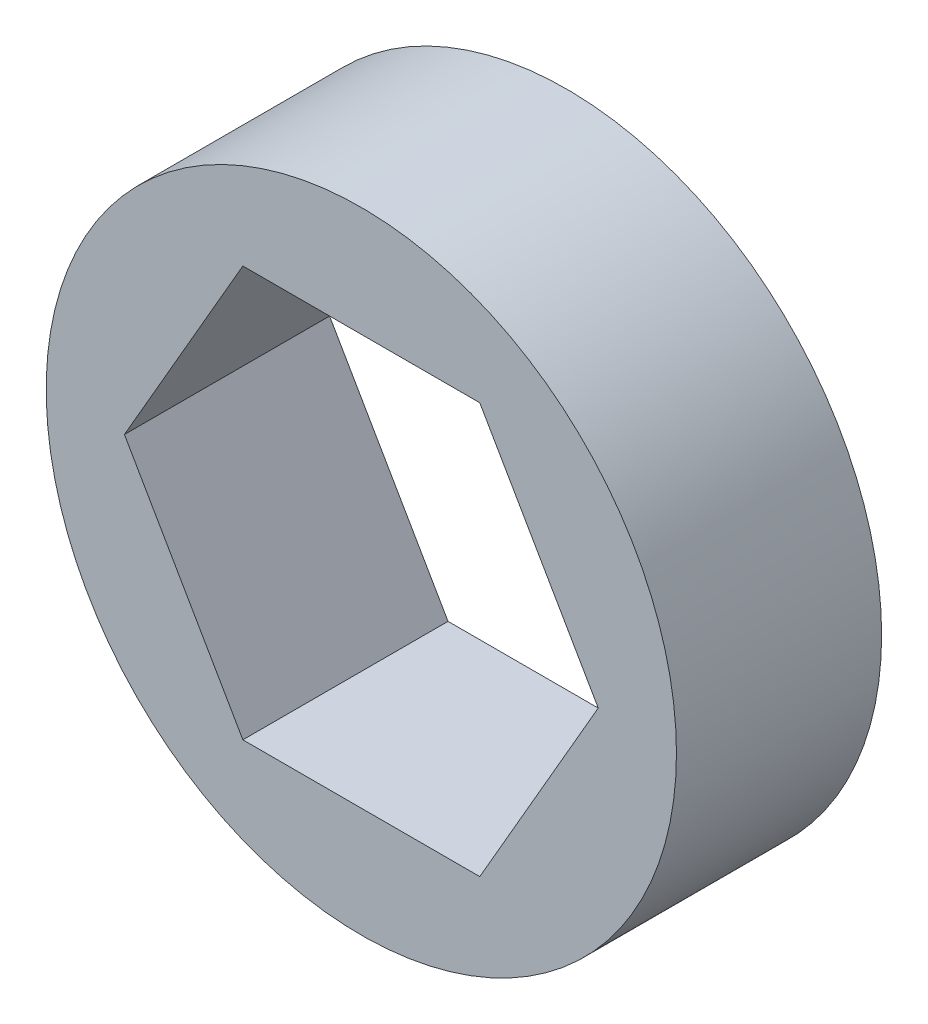
ISO-10303-21;
HEADER;
FILE_DESCRIPTION(('STEP AP214'),'2;1');
FILE_NAME('part.step','',(''),(''),'','','');
FILE_SCHEMA(('AUTOMOTIVE_DESIGN { 1 0 10303 214 1 1 1 1 }'));
ENDSEC;
DATA;
#1=APPLICATION_CONTEXT('core data for automotive mechanical design processes');
#2=APPLICATION_PROTOCOL_DEFINITION('international standard','automotive_design',2000,#1);
#3=PRODUCT_CONTEXT('',#1,'mechanical');
#4=PRODUCT('Part','Part','',(#3));
#5=PRODUCT_RELATED_PRODUCT_CATEGORY('part','',(#4));
#6=PRODUCT_DEFINITION_FORMATION('','',#4);
#7=PRODUCT_DEFINITION_CONTEXT('part definition',#1,'design');
#8=PRODUCT_DEFINITION('design','',#6,#7);
#9=PRODUCT_DEFINITION_SHAPE('','',#8);
#10=(LENGTH_UNIT() NAMED_UNIT(*) SI_UNIT(.MILLI.,.METRE.));
#11=(NAMED_UNIT(*) PLANE_ANGLE_UNIT() SI_UNIT($,.RADIAN.));
#12=(NAMED_UNIT(*) SI_UNIT($,.STERADIAN.) SOLID_ANGLE_UNIT());
#13=UNCERTAINTY_MEASURE_WITH_UNIT(LENGTH_MEASURE(1.E-05),#10,'distance_accuracy_value','');
#14=(GEOMETRIC_REPRESENTATION_CONTEXT(3) GLOBAL_UNCERTAINTY_ASSIGNED_CONTEXT((#13)) GLOBAL_UNIT_ASSIGNED_CONTEXT((#10,
#11,#12)) REPRESENTATION_CONTEXT('',''));
#15=CARTESIAN_POINT('',(0.,0.,0.));
#16=DIRECTION('',(0.,0.,1.));
#17=DIRECTION('',(1.,0.,0.));
#18=AXIS2_PLACEMENT_3D('',#15,#16,#17);
#19=CARTESIAN_POINT('',(0.,0.,6.35));
#20=DIRECTION('',(0.,0.,1.));
#21=DIRECTION('',(1.,0.,0.));
#22=AXIS2_PLACEMENT_3D('',#19,#20,#21);
#23=PLANE('',#22);
#24=CARTESIAN_POINT('',(0.,0.,6.35));
#25=DIRECTION('',(0.,0.,1.));
#26=DIRECTION('',(1.,0.,0.));
#27=AXIS2_PLACEMENT_3D('',#24,#25,#26);
#28=CIRCLE('',#27,9.7536);
#29=CARTESIAN_POINT('',(9.7536,0.,6.35));
#30=VERTEX_POINT('',#29);
#31=EDGE_CURVE('E11',#30,#30,#28,.T.);
#32=ORIENTED_EDGE('',*,*,#31,.T.);
#33=EDGE_LOOP('',(#32));
#34=FACE_BOUND('',#33,.T.);
#35=DIRECTION('',(0.5,-0.866025403784439,0.));
#36=VECTOR('',#35,1.);
#37=CARTESIAN_POINT('',(-7.33234841870825,0.,6.35));
#38=LINE('',#37,#36);
#39=CARTESIAN_POINT('',(-7.33234841870825,0.,6.35));
#40=VERTEX_POINT('',#39);
#41=CARTESIAN_POINT('',(-3.66617420935412,-6.35,6.35));
#42=VERTEX_POINT('',#41);
#43=EDGE_CURVE('E94',#40,#42,#38,.T.);
#44=ORIENTED_EDGE('',*,*,#43,.F.);
#45=DIRECTION('',(-0.5,-0.866025403784439,0.));
#46=VECTOR('',#45,1.);
#47=CARTESIAN_POINT('',(-3.66617420935412,6.35,6.35));
#48=LINE('',#47,#46);
#49=CARTESIAN_POINT('',(-3.66617420935412,6.35,6.35));
#50=VERTEX_POINT('',#49);
#51=EDGE_CURVE('E86',#50,#40,#48,.T.);
#52=ORIENTED_EDGE('',*,*,#51,.F.);
#53=DIRECTION('',(-1.,0.,0.));
#54=VECTOR('',#53,1.);
#55=CARTESIAN_POINT('',(3.66617420935412,6.35,6.35));
#56=LINE('',#55,#54);
#57=CARTESIAN_POINT('',(3.66617420935412,6.35,6.35));
#58=VERTEX_POINT('',#57);
#59=EDGE_CURVE('E114',#58,#50,#56,.T.);
#60=ORIENTED_EDGE('',*,*,#59,.F.);
#61=DIRECTION('',(-0.5,0.866025403784439,0.));
#62=VECTOR('',#61,1.);
#63=CARTESIAN_POINT('',(7.33234841870825,0.,6.35));
#64=LINE('',#63,#62);
#65=CARTESIAN_POINT('',(7.33234841870825,0.,6.35));
#66=VERTEX_POINT('',#65);
#67=EDGE_CURVE('E112',#66,#58,#64,.T.);
#68=ORIENTED_EDGE('',*,*,#67,.F.);
#69=DIRECTION('',(0.5,0.866025403784439,0.));
#70=VECTOR('',#69,1.);
#71=CARTESIAN_POINT('',(3.66617420935412,-6.35,6.35));
#72=LINE('',#71,#70);
#73=CARTESIAN_POINT('',(3.66617420935412,-6.35,6.35));
#74=VERTEX_POINT('',#73);
#75=EDGE_CURVE('E108',#74,#66,#72,.T.);
#76=ORIENTED_EDGE('',*,*,#75,.F.);
#77=DIRECTION('',(1.,0.,0.));
#78=VECTOR('',#77,1.);
#79=CARTESIAN_POINT('',(-3.66617420935412,-6.35,6.35));
#80=LINE('',#79,#78);
#81=EDGE_CURVE('E106',#42,#74,#80,.T.);
#82=ORIENTED_EDGE('',*,*,#81,.F.);
#83=EDGE_LOOP('',(#44,#52,#60,#68,#76,#82));
#84=FACE_BOUND('',#83,.T.);
#85=ADVANCED_FACE('F33',(#34,#84),#23,.T.);
#86=CARTESIAN_POINT('',(0.,0.,0.));
#87=DIRECTION('',(0.,0.,1.));
#88=DIRECTION('',(1.,0.,0.));
#89=AXIS2_PLACEMENT_3D('',#86,#87,#88);
#90=PLANE('',#89);
#91=CARTESIAN_POINT('',(0.,0.,0.));
#92=DIRECTION('',(0.,0.,1.));
#93=DIRECTION('',(1.,0.,0.));
#94=AXIS2_PLACEMENT_3D('',#91,#92,#93);
#95=CIRCLE('',#94,9.7536);
#96=CARTESIAN_POINT('',(9.7536,0.,0.));
#97=VERTEX_POINT('',#96);
#98=EDGE_CURVE('E37',#97,#97,#95,.T.);
#99=ORIENTED_EDGE('',*,*,#98,.F.);
#100=EDGE_LOOP('',(#99));
#101=FACE_BOUND('',#100,.T.);
#102=DIRECTION('',(-0.5,-0.866025403784439,0.));
#103=VECTOR('',#102,1.);
#104=CARTESIAN_POINT('',(-3.66617420935412,6.35,0.));
#105=LINE('',#104,#103);
#106=CARTESIAN_POINT('',(-3.66617420935412,6.35,0.));
#107=VERTEX_POINT('',#106);
#108=CARTESIAN_POINT('',(-7.33234841870825,0.,0.));
#109=VERTEX_POINT('',#108);
#110=EDGE_CURVE('E56',#107,#109,#105,.T.);
#111=ORIENTED_EDGE('',*,*,#110,.T.);
#112=DIRECTION('',(0.5,-0.866025403784439,0.));
#113=VECTOR('',#112,1.);
#114=CARTESIAN_POINT('',(-7.33234841870825,0.,0.));
#115=LINE('',#114,#113);
#116=CARTESIAN_POINT('',(-3.66617420935412,-6.35,0.));
#117=VERTEX_POINT('',#116);
#118=EDGE_CURVE('E101',#109,#117,#115,.T.);
#119=ORIENTED_EDGE('',*,*,#118,.T.);
#120=DIRECTION('',(1.,0.,0.));
#121=VECTOR('',#120,1.);
#122=CARTESIAN_POINT('',(-3.66617420935412,-6.35,0.));
#123=LINE('',#122,#121);
#124=CARTESIAN_POINT('',(3.66617420935412,-6.35,0.));
#125=VERTEX_POINT('',#124);
#126=EDGE_CURVE('E118',#117,#125,#123,.T.);
#127=ORIENTED_EDGE('',*,*,#126,.T.);
#128=DIRECTION('',(0.5,0.866025403784439,0.));
#129=VECTOR('',#128,1.);
#130=CARTESIAN_POINT('',(3.66617420935412,-6.35,0.));
#131=LINE('',#130,#129);
#132=CARTESIAN_POINT('',(7.33234841870825,0.,0.));
#133=VERTEX_POINT('',#132);
#134=EDGE_CURVE('E121',#125,#133,#131,.T.);
#135=ORIENTED_EDGE('',*,*,#134,.T.);
#136=DIRECTION('',(-0.5,0.866025403784439,0.));
#137=VECTOR('',#136,1.);
#138=CARTESIAN_POINT('',(7.33234841870825,0.,0.));
#139=LINE('',#138,#137);
#140=CARTESIAN_POINT('',(3.66617420935412,6.35,0.));
#141=VERTEX_POINT('',#140);
#142=EDGE_CURVE('E124',#133,#141,#139,.T.);
#143=ORIENTED_EDGE('',*,*,#142,.T.);
#144=DIRECTION('',(-1.,0.,0.));
#145=VECTOR('',#144,1.);
#146=CARTESIAN_POINT('',(3.66617420935412,6.35,0.));
#147=LINE('',#146,#145);
#148=EDGE_CURVE('E95',#141,#107,#147,.T.);
#149=ORIENTED_EDGE('',*,*,#148,.T.);
#150=EDGE_LOOP('',(#111,#119,#127,#135,#143,#149));
#151=FACE_BOUND('',#150,.T.);
#152=ADVANCED_FACE('F141',(#101,#151),#90,.F.);
#153=CARTESIAN_POINT('',(0.,0.,6.35));
#154=DIRECTION('',(0.,0.,-1.));
#155=DIRECTION('',(-1.,0.,0.));
#156=AXIS2_PLACEMENT_3D('',#153,#154,#155);
#157=CYLINDRICAL_SURFACE('',#156,9.7536);
#158=ORIENTED_EDGE('',*,*,#31,.F.);
#159=EDGE_LOOP('',(#158));
#160=FACE_BOUND('',#159,.T.);
#161=ORIENTED_EDGE('',*,*,#98,.T.);
#162=EDGE_LOOP('',(#161));
#163=FACE_BOUND('',#162,.T.);
#164=ADVANCED_FACE('F35',(#160,#163),#157,.T.);
#165=CARTESIAN_POINT('',(-3.66617420935412,6.35,6.35));
#166=DIRECTION('',(0.866025403784439,-0.5,0.));
#167=DIRECTION('',(0.5,0.866025403784439,0.));
#168=AXIS2_PLACEMENT_3D('',#165,#166,#167);
#169=PLANE('',#168);
#170=ORIENTED_EDGE('',*,*,#110,.F.);
#171=DIRECTION('',(0.,0.,-1.));
#172=VECTOR('',#171,1.);
#173=CARTESIAN_POINT('',(-3.66617420935412,6.35,6.35));
#174=LINE('',#173,#172);
#175=EDGE_CURVE('E90',#50,#107,#174,.T.);
#176=ORIENTED_EDGE('',*,*,#175,.F.);
#177=ORIENTED_EDGE('',*,*,#51,.T.);
#178=DIRECTION('',(0.,0.,-1.));
#179=VECTOR('',#178,1.);
#180=CARTESIAN_POINT('',(-7.33234841870825,0.,6.35));
#181=LINE('',#180,#179);
#182=EDGE_CURVE('E89',#40,#109,#181,.T.);
#183=ORIENTED_EDGE('',*,*,#182,.T.);
#184=EDGE_LOOP('',(#170,#176,#177,#183));
#185=FACE_BOUND('',#184,.T.);
#186=ADVANCED_FACE('F88',(#185),#169,.T.);
#187=CARTESIAN_POINT('',(-7.33234841870825,0.,6.35));
#188=DIRECTION('',(0.866025403784439,0.5,0.));
#189=DIRECTION('',(-0.5,0.866025403784439,0.));
#190=AXIS2_PLACEMENT_3D('',#187,#188,#189);
#191=PLANE('',#190);
#192=ORIENTED_EDGE('',*,*,#118,.F.);
#193=ORIENTED_EDGE('',*,*,#182,.F.);
#194=ORIENTED_EDGE('',*,*,#43,.T.);
#195=DIRECTION('',(0.,0.,-1.));
#196=VECTOR('',#195,1.);
#197=CARTESIAN_POINT('',(-3.66617420935412,-6.35,6.35));
#198=LINE('',#197,#196);
#199=EDGE_CURVE('E102',#42,#117,#198,.T.);
#200=ORIENTED_EDGE('',*,*,#199,.T.);
#201=EDGE_LOOP('',(#192,#193,#194,#200));
#202=FACE_BOUND('',#201,.T.);
#203=ADVANCED_FACE('F98',(#202),#191,.T.);
#204=CARTESIAN_POINT('',(-3.66617420935412,-6.35,6.35));
#205=DIRECTION('',(0.,1.,0.));
#206=DIRECTION('',(-1.,0.,0.));
#207=AXIS2_PLACEMENT_3D('',#204,#205,#206);
#208=PLANE('',#207);
#209=ORIENTED_EDGE('',*,*,#126,.F.);
#210=ORIENTED_EDGE('',*,*,#199,.F.);
#211=ORIENTED_EDGE('',*,*,#81,.T.);
#212=DIRECTION('',(0.,0.,-1.));
#213=VECTOR('',#212,1.);
#214=CARTESIAN_POINT('',(3.66617420935412,-6.35,6.35));
#215=LINE('',#214,#213);
#216=EDGE_CURVE('E133',#74,#125,#215,.T.);
#217=ORIENTED_EDGE('',*,*,#216,.T.);
#218=EDGE_LOOP('',(#209,#210,#211,#217));
#219=FACE_BOUND('',#218,.T.);
#220=ADVANCED_FACE('F137',(#219),#208,.T.);
#221=CARTESIAN_POINT('',(3.66617420935412,-6.35,6.35));
#222=DIRECTION('',(-0.866025403784439,0.5,0.));
#223=DIRECTION('',(-0.5,-0.866025403784439,0.));
#224=AXIS2_PLACEMENT_3D('',#221,#222,#223);
#225=PLANE('',#224);
#226=ORIENTED_EDGE('',*,*,#134,.F.);
#227=ORIENTED_EDGE('',*,*,#216,.F.);
#228=ORIENTED_EDGE('',*,*,#75,.T.);
#229=DIRECTION('',(0.,0.,-1.));
#230=VECTOR('',#229,1.);
#231=CARTESIAN_POINT('',(7.33234841870825,0.,6.35));
#232=LINE('',#231,#230);
#233=EDGE_CURVE('E131',#66,#133,#232,.T.);
#234=ORIENTED_EDGE('',*,*,#233,.T.);
#235=EDGE_LOOP('',(#226,#227,#228,#234));
#236=FACE_BOUND('',#235,.T.);
#237=ADVANCED_FACE('F149',(#236),#225,.T.);
#238=CARTESIAN_POINT('',(7.33234841870825,0.,6.35));
#239=DIRECTION('',(-0.866025403784439,-0.5,0.));
#240=DIRECTION('',(0.5,-0.866025403784439,0.));
#241=AXIS2_PLACEMENT_3D('',#238,#239,#240);
#242=PLANE('',#241);
#243=ORIENTED_EDGE('',*,*,#142,.F.);
#244=ORIENTED_EDGE('',*,*,#233,.F.);
#245=ORIENTED_EDGE('',*,*,#67,.T.);
#246=DIRECTION('',(0.,0.,-1.));
#247=VECTOR('',#246,1.);
#248=CARTESIAN_POINT('',(3.66617420935412,6.35,6.35));
#249=LINE('',#248,#247);
#250=EDGE_CURVE('E48',#58,#141,#249,.T.);
#251=ORIENTED_EDGE('',*,*,#250,.T.);
#252=EDGE_LOOP('',(#243,#244,#245,#251));
#253=FACE_BOUND('',#252,.T.);
#254=ADVANCED_FACE('F147',(#253),#242,.T.);
#255=CARTESIAN_POINT('',(3.66617420935412,6.35,6.35));
#256=DIRECTION('',(0.,-1.,0.));
#257=DIRECTION('',(1.,0.,0.));
#258=AXIS2_PLACEMENT_3D('',#255,#256,#257);
#259=PLANE('',#258);
#260=ORIENTED_EDGE('',*,*,#148,.F.);
#261=ORIENTED_EDGE('',*,*,#250,.F.);
#262=ORIENTED_EDGE('',*,*,#59,.T.);
#263=ORIENTED_EDGE('',*,*,#175,.T.);
#264=EDGE_LOOP('',(#260,#261,#262,#263));
#265=FACE_BOUND('',#264,.T.);
#266=ADVANCED_FACE('F143',(#265),#259,.T.);
#267=CLOSED_SHELL('',(#85,#152,#164,#186,#203,#220,#237,#254,#266));
#268=MANIFOLD_SOLID_BREP('B2',#267);
#269=ADVANCED_BREP_SHAPE_REPRESENTATION('',(#18,#268),#14);
#270=SHAPE_DEFINITION_REPRESENTATION(#9,#269);
ENDSEC;
END-ISO-10303-21;
